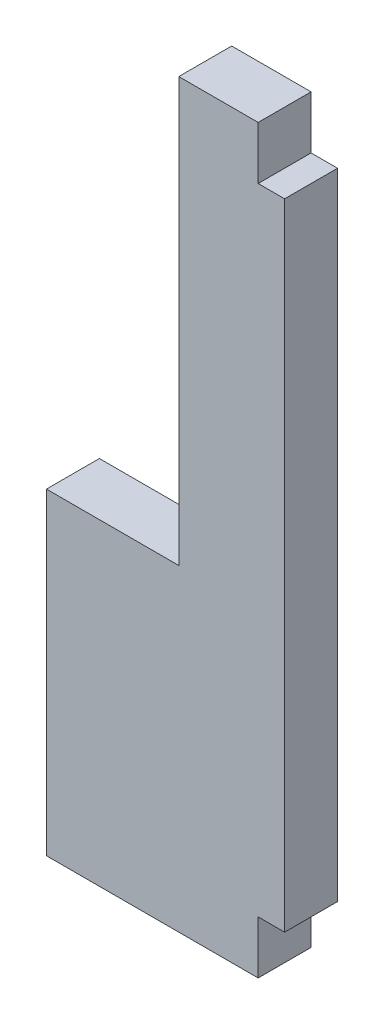
ISO-10303-21;
HEADER;
FILE_DESCRIPTION(('STEP AP214'),'2;1');
FILE_NAME('part.step','',(''),(''),'','','');
FILE_SCHEMA(('AUTOMOTIVE_DESIGN { 1 0 10303 214 1 1 1 1 }'));
ENDSEC;
DATA;
#1=APPLICATION_CONTEXT('core data for automotive mechanical design processes');
#2=APPLICATION_PROTOCOL_DEFINITION('international standard','automotive_design',2000,#1);
#3=PRODUCT_CONTEXT('',#1,'mechanical');
#4=PRODUCT('Part','Part','',(#3));
#5=PRODUCT_RELATED_PRODUCT_CATEGORY('part','',(#4));
#6=PRODUCT_DEFINITION_FORMATION('','',#4);
#7=PRODUCT_DEFINITION_CONTEXT('part definition',#1,'design');
#8=PRODUCT_DEFINITION('design','',#6,#7);
#9=PRODUCT_DEFINITION_SHAPE('','',#8);
#10=(LENGTH_UNIT() NAMED_UNIT(*) SI_UNIT(.MILLI.,.METRE.));
#11=(NAMED_UNIT(*) PLANE_ANGLE_UNIT() SI_UNIT($,.RADIAN.));
#12=(NAMED_UNIT(*) SI_UNIT($,.STERADIAN.) SOLID_ANGLE_UNIT());
#13=UNCERTAINTY_MEASURE_WITH_UNIT(LENGTH_MEASURE(1.E-05),#10,'distance_accuracy_value','');
#14=(GEOMETRIC_REPRESENTATION_CONTEXT(3) GLOBAL_UNCERTAINTY_ASSIGNED_CONTEXT((#13)) GLOBAL_UNIT_ASSIGNED_CONTEXT((#10,
#11,#12)) REPRESENTATION_CONTEXT('',''));
#15=CARTESIAN_POINT('',(0.,0.,0.));
#16=DIRECTION('',(0.,0.,1.));
#17=DIRECTION('',(1.,0.,0.));
#18=AXIS2_PLACEMENT_3D('',#15,#16,#17);
#19=CARTESIAN_POINT('',(-5.00000000000001,120.,10.));
#20=DIRECTION('',(-1.,0.,0.));
#21=DIRECTION('',(0.,-1.,0.));
#22=AXIS2_PLACEMENT_3D('',#19,#20,#21);
#23=PLANE('',#22);
#24=DIRECTION('',(0.,1.,0.));
#25=VECTOR('',#24,1.);
#26=CARTESIAN_POINT('',(-5.00000000000001,120.,0.));
#27=LINE('',#26,#25);
#28=CARTESIAN_POINT('',(-5.00000000000001,120.,0.));
#29=VERTEX_POINT('',#28);
#30=CARTESIAN_POINT('',(-5.00000000000001,130.,0.));
#31=VERTEX_POINT('',#30);
#32=EDGE_CURVE('E141',#29,#31,#27,.T.);
#33=ORIENTED_EDGE('',*,*,#32,.T.);
#34=DIRECTION('',(0.,0.,-1.));
#35=VECTOR('',#34,1.);
#36=CARTESIAN_POINT('',(-5.00000000000001,130.,10.));
#37=LINE('',#36,#35);
#38=CARTESIAN_POINT('',(-5.00000000000001,130.,10.));
#39=VERTEX_POINT('',#38);
#40=EDGE_CURVE('E11',#39,#31,#37,.T.);
#41=ORIENTED_EDGE('',*,*,#40,.F.);
#42=DIRECTION('',(0.,1.,0.));
#43=VECTOR('',#42,1.);
#44=CARTESIAN_POINT('',(-5.00000000000001,120.,10.));
#45=LINE('',#44,#43);
#46=CARTESIAN_POINT('',(-5.00000000000001,120.,10.));
#47=VERTEX_POINT('',#46);
#48=EDGE_CURVE('E159',#47,#39,#45,.T.);
#49=ORIENTED_EDGE('',*,*,#48,.F.);
#50=DIRECTION('',(0.,0.,-1.));
#51=VECTOR('',#50,1.);
#52=CARTESIAN_POINT('',(-5.00000000000001,120.,10.));
#53=LINE('',#52,#51);
#54=EDGE_CURVE('E137',#47,#29,#53,.T.);
#55=ORIENTED_EDGE('',*,*,#54,.T.);
#56=EDGE_LOOP('',(#33,#41,#49,#55));
#57=FACE_BOUND('',#56,.T.);
#58=ADVANCED_FACE('F33',(#57),#23,.F.);
#59=CARTESIAN_POINT('',(-5.00000000000001,130.,10.));
#60=DIRECTION('',(0.,-1.,0.));
#61=DIRECTION('',(0.,0.,-1.));
#62=AXIS2_PLACEMENT_3D('',#59,#60,#61);
#63=PLANE('',#62);
#64=DIRECTION('',(-1.,0.,0.));
#65=VECTOR('',#64,1.);
#66=CARTESIAN_POINT('',(-5.00000000000001,130.,0.));
#67=LINE('',#66,#65);
#68=CARTESIAN_POINT('',(-20.,130.,0.));
#69=VERTEX_POINT('',#68);
#70=EDGE_CURVE('E144',#31,#69,#67,.T.);
#71=ORIENTED_EDGE('',*,*,#70,.T.);
#72=DIRECTION('',(0.,0.,-1.));
#73=VECTOR('',#72,1.);
#74=CARTESIAN_POINT('',(-20.,130.,10.));
#75=LINE('',#74,#73);
#76=CARTESIAN_POINT('',(-20.,130.,10.));
#77=VERTEX_POINT('',#76);
#78=EDGE_CURVE('E41',#77,#69,#75,.T.);
#79=ORIENTED_EDGE('',*,*,#78,.F.);
#80=DIRECTION('',(-1.,0.,0.));
#81=VECTOR('',#80,1.);
#82=CARTESIAN_POINT('',(-5.00000000000001,130.,10.));
#83=LINE('',#82,#81);
#84=EDGE_CURVE('E98',#39,#77,#83,.T.);
#85=ORIENTED_EDGE('',*,*,#84,.F.);
#86=ORIENTED_EDGE('',*,*,#40,.T.);
#87=EDGE_LOOP('',(#71,#79,#85,#86));
#88=FACE_BOUND('',#87,.T.);
#89=ADVANCED_FACE('F208',(#88),#63,.F.);
#90=CARTESIAN_POINT('',(-20.,130.,10.));
#91=DIRECTION('',(1.,0.,0.));
#92=DIRECTION('',(0.,1.,0.));
#93=AXIS2_PLACEMENT_3D('',#90,#91,#92);
#94=PLANE('',#93);
#95=DIRECTION('',(0.,-1.,0.));
#96=VECTOR('',#95,1.);
#97=CARTESIAN_POINT('',(-20.,130.,0.));
#98=LINE('',#97,#96);
#99=CARTESIAN_POINT('',(-20.,50.,0.));
#100=VERTEX_POINT('',#99);
#101=EDGE_CURVE('E146',#69,#100,#98,.T.);
#102=ORIENTED_EDGE('',*,*,#101,.T.);
#103=DIRECTION('',(0.,0.,-1.));
#104=VECTOR('',#103,1.);
#105=CARTESIAN_POINT('',(-20.,50.,10.));
#106=LINE('',#105,#104);
#107=CARTESIAN_POINT('',(-20.,50.,10.));
#108=VERTEX_POINT('',#107);
#109=EDGE_CURVE('E172',#108,#100,#106,.T.);
#110=ORIENTED_EDGE('',*,*,#109,.F.);
#111=DIRECTION('',(0.,-1.,0.));
#112=VECTOR('',#111,1.);
#113=CARTESIAN_POINT('',(-20.,130.,10.));
#114=LINE('',#113,#112);
#115=EDGE_CURVE('E180',#77,#108,#114,.T.);
#116=ORIENTED_EDGE('',*,*,#115,.F.);
#117=ORIENTED_EDGE('',*,*,#78,.T.);
#118=EDGE_LOOP('',(#102,#110,#116,#117));
#119=FACE_BOUND('',#118,.T.);
#120=ADVANCED_FACE('F178',(#119),#94,.F.);
#121=CARTESIAN_POINT('',(-20.,50.,10.));
#122=DIRECTION('',(0.,-1.,0.));
#123=DIRECTION('',(1.,0.,0.));
#124=AXIS2_PLACEMENT_3D('',#121,#122,#123);
#125=PLANE('',#124);
#126=DIRECTION('',(-1.,0.,0.));
#127=VECTOR('',#126,1.);
#128=CARTESIAN_POINT('',(-20.,50.,0.));
#129=LINE('',#128,#127);
#130=CARTESIAN_POINT('',(-45.,50.,0.));
#131=VERTEX_POINT('',#130);
#132=EDGE_CURVE('E148',#100,#131,#129,.T.);
#133=ORIENTED_EDGE('',*,*,#132,.T.);
#134=DIRECTION('',(0.,0.,-1.));
#135=VECTOR('',#134,1.);
#136=CARTESIAN_POINT('',(-45.,50.,10.));
#137=LINE('',#136,#135);
#138=CARTESIAN_POINT('',(-45.,50.,10.));
#139=VERTEX_POINT('',#138);
#140=EDGE_CURVE('E169',#139,#131,#137,.T.);
#141=ORIENTED_EDGE('',*,*,#140,.F.);
#142=DIRECTION('',(-1.,0.,0.));
#143=VECTOR('',#142,1.);
#144=CARTESIAN_POINT('',(-20.,50.,10.));
#145=LINE('',#144,#143);
#146=EDGE_CURVE('E198',#108,#139,#145,.T.);
#147=ORIENTED_EDGE('',*,*,#146,.F.);
#148=ORIENTED_EDGE('',*,*,#109,.T.);
#149=EDGE_LOOP('',(#133,#141,#147,#148));
#150=FACE_BOUND('',#149,.T.);
#151=ADVANCED_FACE('F189',(#150),#125,.F.);
#152=CARTESIAN_POINT('',(-45.,50.,10.));
#153=DIRECTION('',(1.,0.,0.));
#154=DIRECTION('',(0.,1.,0.));
#155=AXIS2_PLACEMENT_3D('',#152,#153,#154);
#156=PLANE('',#155);
#157=DIRECTION('',(0.,-1.,0.));
#158=VECTOR('',#157,1.);
#159=CARTESIAN_POINT('',(-45.,50.,0.));
#160=LINE('',#159,#158);
#161=CARTESIAN_POINT('',(-45.,-10.,0.));
#162=VERTEX_POINT('',#161);
#163=EDGE_CURVE('E150',#131,#162,#160,.T.);
#164=ORIENTED_EDGE('',*,*,#163,.T.);
#165=DIRECTION('',(0.,0.,-1.));
#166=VECTOR('',#165,1.);
#167=CARTESIAN_POINT('',(-45.,-10.,10.));
#168=LINE('',#167,#166);
#169=CARTESIAN_POINT('',(-45.,-10.,10.));
#170=VERTEX_POINT('',#169);
#171=EDGE_CURVE('E166',#170,#162,#168,.T.);
#172=ORIENTED_EDGE('',*,*,#171,.F.);
#173=DIRECTION('',(0.,-1.,0.));
#174=VECTOR('',#173,1.);
#175=CARTESIAN_POINT('',(-45.,50.,10.));
#176=LINE('',#175,#174);
#177=EDGE_CURVE('E195',#139,#170,#176,.T.);
#178=ORIENTED_EDGE('',*,*,#177,.F.);
#179=ORIENTED_EDGE('',*,*,#140,.T.);
#180=EDGE_LOOP('',(#164,#172,#178,#179));
#181=FACE_BOUND('',#180,.T.);
#182=ADVANCED_FACE('F193',(#181),#156,.F.);
#183=CARTESIAN_POINT('',(-45.,-10.,10.));
#184=DIRECTION('',(0.,1.,0.));
#185=DIRECTION('',(0.,0.,1.));
#186=AXIS2_PLACEMENT_3D('',#183,#184,#185);
#187=PLANE('',#186);
#188=DIRECTION('',(1.,0.,0.));
#189=VECTOR('',#188,1.);
#190=CARTESIAN_POINT('',(-45.,-10.,0.));
#191=LINE('',#190,#189);
#192=CARTESIAN_POINT('',(-4.99999999999998,-10.,0.));
#193=VERTEX_POINT('',#192);
#194=EDGE_CURVE('E152',#162,#193,#191,.T.);
#195=ORIENTED_EDGE('',*,*,#194,.T.);
#196=DIRECTION('',(0.,0.,-1.));
#197=VECTOR('',#196,1.);
#198=CARTESIAN_POINT('',(-4.99999999999998,-10.,10.));
#199=LINE('',#198,#197);
#200=CARTESIAN_POINT('',(-4.99999999999998,-10.,10.));
#201=VERTEX_POINT('',#200);
#202=EDGE_CURVE('E163',#201,#193,#199,.T.);
#203=ORIENTED_EDGE('',*,*,#202,.F.);
#204=DIRECTION('',(1.,0.,0.));
#205=VECTOR('',#204,1.);
#206=CARTESIAN_POINT('',(-45.,-10.,10.));
#207=LINE('',#206,#205);
#208=EDGE_CURVE('E197',#170,#201,#207,.T.);
#209=ORIENTED_EDGE('',*,*,#208,.F.);
#210=ORIENTED_EDGE('',*,*,#171,.T.);
#211=EDGE_LOOP('',(#195,#203,#209,#210));
#212=FACE_BOUND('',#211,.T.);
#213=ADVANCED_FACE('F220',(#212),#187,.F.);
#214=CARTESIAN_POINT('',(-4.99999999999998,-10.,10.));
#215=DIRECTION('',(-1.,0.,0.));
#216=DIRECTION('',(0.,-1.,0.));
#217=AXIS2_PLACEMENT_3D('',#214,#215,#216);
#218=PLANE('',#217);
#219=DIRECTION('',(0.,1.,0.));
#220=VECTOR('',#219,1.);
#221=CARTESIAN_POINT('',(-4.99999999999998,-10.,0.));
#222=LINE('',#221,#220);
#223=CARTESIAN_POINT('',(-4.99999999999998,0.,0.));
#224=VERTEX_POINT('',#223);
#225=EDGE_CURVE('E154',#193,#224,#222,.T.);
#226=ORIENTED_EDGE('',*,*,#225,.T.);
#227=DIRECTION('',(0.,0.,-1.));
#228=VECTOR('',#227,1.);
#229=CARTESIAN_POINT('',(-4.99999999999998,0.,10.));
#230=LINE('',#229,#228);
#231=CARTESIAN_POINT('',(-4.99999999999998,0.,10.));
#232=VERTEX_POINT('',#231);
#233=EDGE_CURVE('E132',#232,#224,#230,.T.);
#234=ORIENTED_EDGE('',*,*,#233,.F.);
#235=DIRECTION('',(0.,1.,0.));
#236=VECTOR('',#235,1.);
#237=CARTESIAN_POINT('',(-4.99999999999998,-10.,10.));
#238=LINE('',#237,#236);
#239=EDGE_CURVE('E123',#201,#232,#238,.T.);
#240=ORIENTED_EDGE('',*,*,#239,.F.);
#241=ORIENTED_EDGE('',*,*,#202,.T.);
#242=EDGE_LOOP('',(#226,#234,#240,#241));
#243=FACE_BOUND('',#242,.T.);
#244=ADVANCED_FACE('F223',(#243),#218,.F.);
#245=CARTESIAN_POINT('',(-4.99999999999998,0.,10.));
#246=DIRECTION('',(0.,1.,0.));
#247=DIRECTION('',(0.,0.,1.));
#248=AXIS2_PLACEMENT_3D('',#245,#246,#247);
#249=PLANE('',#248);
#250=DIRECTION('',(1.,0.,0.));
#251=VECTOR('',#250,1.);
#252=CARTESIAN_POINT('',(-4.99999999999998,0.,0.));
#253=LINE('',#252,#251);
#254=CARTESIAN_POINT('',(0.,0.,0.));
#255=VERTEX_POINT('',#254);
#256=EDGE_CURVE('E131',#224,#255,#253,.T.);
#257=ORIENTED_EDGE('',*,*,#256,.T.);
#258=DIRECTION('',(0.,0.,-1.));
#259=VECTOR('',#258,1.);
#260=CARTESIAN_POINT('',(0.,0.,10.));
#261=LINE('',#260,#259);
#262=CARTESIAN_POINT('',(0.,0.,10.));
#263=VERTEX_POINT('',#262);
#264=EDGE_CURVE('E128',#263,#255,#261,.T.);
#265=ORIENTED_EDGE('',*,*,#264,.F.);
#266=DIRECTION('',(1.,0.,0.));
#267=VECTOR('',#266,1.);
#268=CARTESIAN_POINT('',(-4.99999999999998,0.,10.));
#269=LINE('',#268,#267);
#270=EDGE_CURVE('E117',#232,#263,#269,.T.);
#271=ORIENTED_EDGE('',*,*,#270,.F.);
#272=ORIENTED_EDGE('',*,*,#233,.T.);
#273=EDGE_LOOP('',(#257,#265,#271,#272));
#274=FACE_BOUND('',#273,.T.);
#275=ADVANCED_FACE('F129',(#274),#249,.F.);
#276=CARTESIAN_POINT('',(0.,0.,10.));
#277=DIRECTION('',(-1.,0.,0.));
#278=DIRECTION('',(0.,-1.,0.));
#279=AXIS2_PLACEMENT_3D('',#276,#277,#278);
#280=PLANE('',#279);
#281=DIRECTION('',(0.,1.,0.));
#282=VECTOR('',#281,1.);
#283=CARTESIAN_POINT('',(0.,0.,0.));
#284=LINE('',#283,#282);
#285=CARTESIAN_POINT('',(0.,120.,0.));
#286=VERTEX_POINT('',#285);
#287=EDGE_CURVE('E84',#255,#286,#284,.T.);
#288=ORIENTED_EDGE('',*,*,#287,.T.);
#289=DIRECTION('',(0.,0.,-1.));
#290=VECTOR('',#289,1.);
#291=CARTESIAN_POINT('',(0.,120.,10.));
#292=LINE('',#291,#290);
#293=CARTESIAN_POINT('',(0.,120.,10.));
#294=VERTEX_POINT('',#293);
#295=EDGE_CURVE('E133',#294,#286,#292,.T.);
#296=ORIENTED_EDGE('',*,*,#295,.F.);
#297=DIRECTION('',(0.,1.,0.));
#298=VECTOR('',#297,1.);
#299=CARTESIAN_POINT('',(0.,0.,10.));
#300=LINE('',#299,#298);
#301=EDGE_CURVE('E121',#263,#294,#300,.T.);
#302=ORIENTED_EDGE('',*,*,#301,.F.);
#303=ORIENTED_EDGE('',*,*,#264,.T.);
#304=EDGE_LOOP('',(#288,#296,#302,#303));
#305=FACE_BOUND('',#304,.T.);
#306=ADVANCED_FACE('F135',(#305),#280,.F.);
#307=CARTESIAN_POINT('',(0.,120.,10.));
#308=DIRECTION('',(0.,-1.,0.));
#309=DIRECTION('',(0.,0.,-1.));
#310=AXIS2_PLACEMENT_3D('',#307,#308,#309);
#311=PLANE('',#310);
#312=DIRECTION('',(-1.,0.,0.));
#313=VECTOR('',#312,1.);
#314=CARTESIAN_POINT('',(0.,120.,0.));
#315=LINE('',#314,#313);
#316=EDGE_CURVE('E90',#286,#29,#315,.T.);
#317=ORIENTED_EDGE('',*,*,#316,.T.);
#318=ORIENTED_EDGE('',*,*,#54,.F.);
#319=DIRECTION('',(-1.,0.,0.));
#320=VECTOR('',#319,1.);
#321=CARTESIAN_POINT('',(0.,120.,10.));
#322=LINE('',#321,#320);
#323=EDGE_CURVE('E49',#294,#47,#322,.T.);
#324=ORIENTED_EDGE('',*,*,#323,.F.);
#325=ORIENTED_EDGE('',*,*,#295,.T.);
#326=EDGE_LOOP('',(#317,#318,#324,#325));
#327=FACE_BOUND('',#326,.T.);
#328=ADVANCED_FACE('F232',(#327),#311,.F.);
#329=CARTESIAN_POINT('',(0.,0.,10.));
#330=DIRECTION('',(0.,0.,1.));
#331=DIRECTION('',(1.,0.,0.));
#332=AXIS2_PLACEMENT_3D('',#329,#330,#331);
#333=PLANE('',#332);
#334=ORIENTED_EDGE('',*,*,#48,.T.);
#335=ORIENTED_EDGE('',*,*,#84,.T.);
#336=ORIENTED_EDGE('',*,*,#115,.T.);
#337=ORIENTED_EDGE('',*,*,#146,.T.);
#338=ORIENTED_EDGE('',*,*,#177,.T.);
#339=ORIENTED_EDGE('',*,*,#208,.T.);
#340=ORIENTED_EDGE('',*,*,#239,.T.);
#341=ORIENTED_EDGE('',*,*,#270,.T.);
#342=ORIENTED_EDGE('',*,*,#301,.T.);
#343=ORIENTED_EDGE('',*,*,#323,.T.);
#344=EDGE_LOOP('',(#334,#335,#336,#337,#338,#339,#340,#341,#342,#343));
#345=FACE_BOUND('',#344,.T.);
#346=ADVANCED_FACE('F119',(#345),#333,.T.);
#347=CARTESIAN_POINT('',(0.,0.,0.));
#348=DIRECTION('',(0.,0.,1.));
#349=DIRECTION('',(1.,0.,0.));
#350=AXIS2_PLACEMENT_3D('',#347,#348,#349);
#351=PLANE('',#350);
#352=ORIENTED_EDGE('',*,*,#32,.F.);
#353=ORIENTED_EDGE('',*,*,#316,.F.);
#354=ORIENTED_EDGE('',*,*,#287,.F.);
#355=ORIENTED_EDGE('',*,*,#256,.F.);
#356=ORIENTED_EDGE('',*,*,#225,.F.);
#357=ORIENTED_EDGE('',*,*,#194,.F.);
#358=ORIENTED_EDGE('',*,*,#163,.F.);
#359=ORIENTED_EDGE('',*,*,#132,.F.);
#360=ORIENTED_EDGE('',*,*,#101,.F.);
#361=ORIENTED_EDGE('',*,*,#70,.F.);
#362=EDGE_LOOP('',(#352,#353,#354,#355,#356,#357,#358,#359,#360,#361));
#363=FACE_BOUND('',#362,.T.);
#364=ADVANCED_FACE('F184',(#363),#351,.F.);
#365=CLOSED_SHELL('',(#58,#89,#120,#151,#182,#213,#244,#275,#306,#328,#346,#364));
#366=MANIFOLD_SOLID_BREP('B2',#365);
#367=ADVANCED_BREP_SHAPE_REPRESENTATION('',(#18,#366),#14);
#368=SHAPE_DEFINITION_REPRESENTATION(#9,#367);
ENDSEC;
END-ISO-10303-21;
